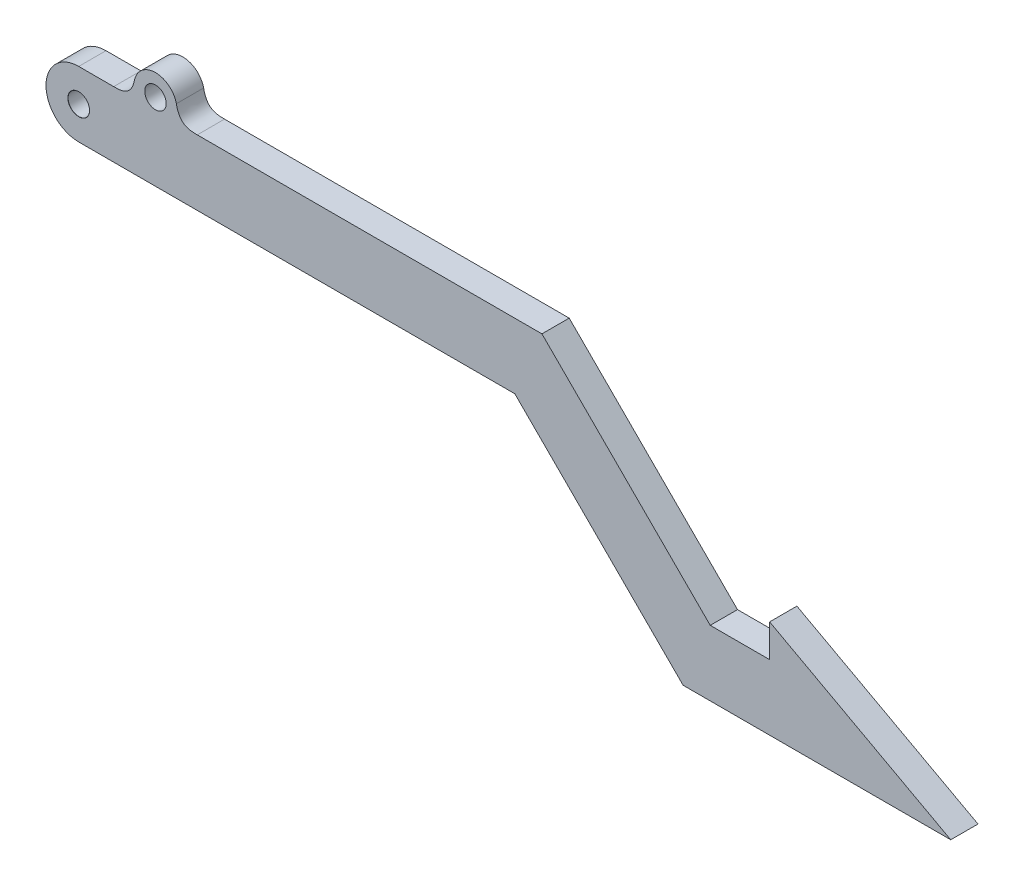
ISO-10303-21;
HEADER;
FILE_DESCRIPTION(('STEP AP214'),'2;1');
FILE_NAME('part.step','',(''),(''),'','','');
FILE_SCHEMA(('AUTOMOTIVE_DESIGN { 1 0 10303 214 1 1 1 1 }'));
ENDSEC;
DATA;
#1=APPLICATION_CONTEXT('core data for automotive mechanical design processes');
#2=APPLICATION_PROTOCOL_DEFINITION('international standard','automotive_design',2000,#1);
#3=PRODUCT_CONTEXT('',#1,'mechanical');
#4=PRODUCT('Part','Part','',(#3));
#5=PRODUCT_RELATED_PRODUCT_CATEGORY('part','',(#4));
#6=PRODUCT_DEFINITION_FORMATION('','',#4);
#7=PRODUCT_DEFINITION_CONTEXT('part definition',#1,'design');
#8=PRODUCT_DEFINITION('design','',#6,#7);
#9=PRODUCT_DEFINITION_SHAPE('','',#8);
#10=(LENGTH_UNIT() NAMED_UNIT(*) SI_UNIT(.MILLI.,.METRE.));
#11=(NAMED_UNIT(*) PLANE_ANGLE_UNIT() SI_UNIT($,.RADIAN.));
#12=(NAMED_UNIT(*) SI_UNIT($,.STERADIAN.) SOLID_ANGLE_UNIT());
#13=UNCERTAINTY_MEASURE_WITH_UNIT(LENGTH_MEASURE(1.E-05),#10,'distance_accuracy_value','');
#14=(GEOMETRIC_REPRESENTATION_CONTEXT(3) GLOBAL_UNCERTAINTY_ASSIGNED_CONTEXT((#13)) GLOBAL_UNIT_ASSIGNED_CONTEXT((#10,
#11,#12)) REPRESENTATION_CONTEXT('',''));
#15=CARTESIAN_POINT('',(0.,0.,0.));
#16=DIRECTION('',(0.,0.,1.));
#17=DIRECTION('',(1.,0.,0.));
#18=AXIS2_PLACEMENT_3D('',#15,#16,#17);
#19=CARTESIAN_POINT('',(0.,52.1634824299942,6.35));
#20=DIRECTION('',(0.,-1.,0.));
#21=DIRECTION('',(1.,0.,0.));
#22=AXIS2_PLACEMENT_3D('',#19,#20,#21);
#23=PLANE('',#22);
#24=DIRECTION('',(-1.,0.,0.));
#25=VECTOR('',#24,1.);
#26=CARTESIAN_POINT('',(0.,52.1634824299942,0.));
#27=LINE('',#26,#25);
#28=CARTESIAN_POINT('',(49.940977794731,52.1634824299942,0.));
#29=VERTEX_POINT('',#28);
#30=CARTESIAN_POINT('',(-30.3177141220988,52.1634824299942,0.));
#31=VERTEX_POINT('',#30);
#32=EDGE_CURVE('E223',#29,#31,#27,.T.);
#33=ORIENTED_EDGE('',*,*,#32,.T.);
#34=CARTESIAN_POINT('',(-30.3177141220988,52.1634824299942,6.6675));
#35=CARTESIAN_POINT('',(-30.3177141220988,52.1634824299942,4.33916666666641));
#36=CARTESIAN_POINT('',(-30.3177141220988,52.1634824299942,2.01083333333333));
#37=CARTESIAN_POINT('',(-30.3177141220988,52.1634824299942,-0.3175));
#38=B_SPLINE_CURVE_WITH_KNOTS('',3,(#34,#35,#36,#37),.UNSPECIFIED.,.F.,.F.,(4,4),(-0.0066675,
0.0003175),.UNSPECIFIED.);
#39=CARTESIAN_POINT('',(-30.3177141220988,52.1634824299942,6.35));
#40=VERTEX_POINT('',#39);
#41=EDGE_CURVE('E345',#31,#40,#38,.F.);
#42=ORIENTED_EDGE('',*,*,#41,.T.);
#43=DIRECTION('',(-1.,0.,0.));
#44=VECTOR('',#43,1.);
#45=CARTESIAN_POINT('',(0.,52.1634824299942,6.35));
#46=LINE('',#45,#44);
#47=CARTESIAN_POINT('',(49.940977794731,52.1634824299942,6.35));
#48=VERTEX_POINT('',#47);
#49=EDGE_CURVE('E158',#48,#40,#46,.T.);
#50=ORIENTED_EDGE('',*,*,#49,.F.);
#51=DIRECTION('',(0.,0.,-1.));
#52=VECTOR('',#51,1.);
#53=CARTESIAN_POINT('',(49.940977794731,52.1634824299942,6.35));
#54=LINE('',#53,#52);
#55=EDGE_CURVE('E436',#48,#29,#54,.T.);
#56=ORIENTED_EDGE('',*,*,#55,.T.);
#57=EDGE_LOOP('',(#33,#42,#50,#56));
#58=FACE_BOUND('',#57,.T.);
#59=ADVANCED_FACE('F49',(#58),#23,.F.);
#60=CARTESIAN_POINT('',(-49.7809356886843,52.1634824299942,6.35));
#61=VERTEX_POINT('',#60);
#62=CARTESIAN_POINT('',(-57.9219241759929,52.1634824299942,6.35));
#63=VERTEX_POINT('',#62);
#64=EDGE_CURVE('E149',#61,#63,#46,.T.);
#65=ORIENTED_EDGE('',*,*,#64,.F.);
#66=CARTESIAN_POINT('',(-49.7809356886843,52.1634824299942,-0.3175));
#67=CARTESIAN_POINT('',(-49.7809356886843,52.1634824299942,2.01083333333333));
#68=CARTESIAN_POINT('',(-49.7809356886843,52.1634824299942,4.33916666666641));
#69=CARTESIAN_POINT('',(-49.7809356886843,52.1634824299942,6.6675));
#70=B_SPLINE_CURVE_WITH_KNOTS('',3,(#66,#67,#68,#69),.UNSPECIFIED.,.F.,.F.,(4,4),(-0.0066675,
0.0003175),.UNSPECIFIED.);
#71=CARTESIAN_POINT('',(-49.7809356886843,52.1634824299942,0.));
#72=VERTEX_POINT('',#71);
#73=EDGE_CURVE('E363',#61,#72,#70,.F.);
#74=ORIENTED_EDGE('',*,*,#73,.T.);
#75=CARTESIAN_POINT('',(-57.9219241759929,52.1634824299942,0.));
#76=VERTEX_POINT('',#75);
#77=EDGE_CURVE('E173',#72,#76,#27,.T.);
#78=ORIENTED_EDGE('',*,*,#77,.T.);
#79=DIRECTION('',(0.,0.,-1.));
#80=VECTOR('',#79,1.);
#81=CARTESIAN_POINT('',(-57.9219241759929,52.1634824299942,6.35));
#82=LINE('',#81,#80);
#83=EDGE_CURVE('E164',#63,#76,#82,.T.);
#84=ORIENTED_EDGE('',*,*,#83,.F.);
#85=EDGE_LOOP('',(#65,#74,#78,#84));
#86=FACE_BOUND('',#85,.T.);
#87=ADVANCED_FACE('F171',(#86),#23,.F.);
#88=CARTESIAN_POINT('',(-57.9219241759929,44.5434824299942,6.35));
#89=DIRECTION('',(0.,0.,-1.));
#90=DIRECTION('',(-1.,0.,0.));
#91=AXIS2_PLACEMENT_3D('',#88,#89,#90);
#92=CYLINDRICAL_SURFACE('',#91,7.61999999999999);
#93=CARTESIAN_POINT('',(-57.9219241759929,44.5434824299942,0.));
#94=DIRECTION('',(0.,0.,1.));
#95=DIRECTION('',(1.,0.,0.));
#96=AXIS2_PLACEMENT_3D('',#93,#94,#95);
#97=CIRCLE('',#96,7.61999999999999);
#98=CARTESIAN_POINT('',(-57.9219241759929,36.9234824299942,0.));
#99=VERTEX_POINT('',#98);
#100=EDGE_CURVE('E228',#76,#99,#97,.T.);
#101=ORIENTED_EDGE('',*,*,#100,.T.);
#102=DIRECTION('',(0.,0.,-1.));
#103=VECTOR('',#102,1.);
#104=CARTESIAN_POINT('',(-57.9219241759929,36.9234824299942,6.35));
#105=LINE('',#104,#103);
#106=CARTESIAN_POINT('',(-57.9219241759929,36.9234824299942,6.35));
#107=VERTEX_POINT('',#106);
#108=EDGE_CURVE('E166',#107,#99,#105,.T.);
#109=ORIENTED_EDGE('',*,*,#108,.F.);
#110=CARTESIAN_POINT('',(-57.9219241759929,44.5434824299942,6.35));
#111=DIRECTION('',(0.,0.,1.));
#112=DIRECTION('',(1.,0.,0.));
#113=AXIS2_PLACEMENT_3D('',#110,#111,#112);
#114=CIRCLE('',#113,7.61999999999999);
#115=EDGE_CURVE('E153',#63,#107,#114,.T.);
#116=ORIENTED_EDGE('',*,*,#115,.F.);
#117=ORIENTED_EDGE('',*,*,#83,.T.);
#118=EDGE_LOOP('',(#101,#109,#116,#117));
#119=FACE_BOUND('',#118,.T.);
#120=ADVANCED_FACE('F163',(#119),#92,.T.);
#121=CARTESIAN_POINT('',(0.,36.9234824299942,6.35));
#122=DIRECTION('',(0.,1.,0.));
#123=DIRECTION('',(0.,0.,1.));
#124=AXIS2_PLACEMENT_3D('',#121,#122,#123);
#125=PLANE('',#124);
#126=DIRECTION('',(1.,0.,0.));
#127=VECTOR('',#126,1.);
#128=CARTESIAN_POINT('',(0.,36.9234824299942,0.));
#129=LINE('',#128,#127);
#130=CARTESIAN_POINT('',(43.628363104165,36.9234824299942,0.));
#131=VERTEX_POINT('',#130);
#132=EDGE_CURVE('E474',#99,#131,#129,.T.);
#133=ORIENTED_EDGE('',*,*,#132,.T.);
#134=DIRECTION('',(0.,0.,-1.));
#135=VECTOR('',#134,1.);
#136=CARTESIAN_POINT('',(43.628363104165,36.9234824299942,6.35));
#137=LINE('',#136,#135);
#138=CARTESIAN_POINT('',(43.628363104165,36.9234824299942,6.35));
#139=VERTEX_POINT('',#138);
#140=EDGE_CURVE('E181',#139,#131,#137,.T.);
#141=ORIENTED_EDGE('',*,*,#140,.F.);
#142=DIRECTION('',(1.,0.,0.));
#143=VECTOR('',#142,1.);
#144=CARTESIAN_POINT('',(0.,36.9234824299942,6.35));
#145=LINE('',#144,#143);
#146=EDGE_CURVE('E169',#107,#139,#145,.T.);
#147=ORIENTED_EDGE('',*,*,#146,.F.);
#148=ORIENTED_EDGE('',*,*,#108,.T.);
#149=EDGE_LOOP('',(#133,#141,#147,#148));
#150=FACE_BOUND('',#149,.T.);
#151=ADVANCED_FACE('F520',(#150),#125,.F.);
#152=CARTESIAN_POINT('',(40.2759227670796,40.2759227670796,6.35));
#153=DIRECTION('',(0.707106781186547,0.707106781186548,0.));
#154=DIRECTION('',(-0.707106781186548,0.707106781186547,0.));
#155=AXIS2_PLACEMENT_3D('',#152,#153,#154);
#156=PLANE('',#155);
#157=DIRECTION('',(0.707106781186548,-0.707106781186547,0.));
#158=VECTOR('',#157,1.);
#159=CARTESIAN_POINT('',(40.2759227670796,40.2759227670796,0.));
#160=LINE('',#159,#158);
#161=CARTESIAN_POINT('',(82.8167567596566,-2.26491122549737,0.));
#162=VERTEX_POINT('',#161);
#163=EDGE_CURVE('E469',#131,#162,#160,.T.);
#164=ORIENTED_EDGE('',*,*,#163,.T.);
#165=DIRECTION('',(0.,0.,-1.));
#166=VECTOR('',#165,1.);
#167=CARTESIAN_POINT('',(82.8167567596566,-2.26491122549737,6.35));
#168=LINE('',#167,#166);
#169=CARTESIAN_POINT('',(82.8167567596566,-2.26491122549737,6.35));
#170=VERTEX_POINT('',#169);
#171=EDGE_CURVE('E458',#170,#162,#168,.T.);
#172=ORIENTED_EDGE('',*,*,#171,.F.);
#173=DIRECTION('',(0.707106781186548,-0.707106781186547,0.));
#174=VECTOR('',#173,1.);
#175=CARTESIAN_POINT('',(40.2759227670796,40.2759227670796,6.35));
#176=LINE('',#175,#174);
#177=EDGE_CURVE('E470',#139,#170,#176,.T.);
#178=ORIENTED_EDGE('',*,*,#177,.F.);
#179=ORIENTED_EDGE('',*,*,#140,.T.);
#180=EDGE_LOOP('',(#164,#172,#178,#179));
#181=FACE_BOUND('',#180,.T.);
#182=ADVANCED_FACE('F467',(#181),#156,.F.);
#183=CARTESIAN_POINT('',(0.,-2.26491122549738,6.35));
#184=DIRECTION('',(0.,1.,0.));
#185=DIRECTION('',(0.,0.,1.));
#186=AXIS2_PLACEMENT_3D('',#183,#184,#185);
#187=PLANE('',#186);
#188=DIRECTION('',(1.,0.,0.));
#189=VECTOR('',#188,1.);
#190=CARTESIAN_POINT('',(0.,-2.26491122549738,0.));
#191=LINE('',#190,#189);
#192=CARTESIAN_POINT('',(145.132424057657,-2.26491122549738,0.));
#193=VERTEX_POINT('',#192);
#194=EDGE_CURVE('E476',#162,#193,#191,.T.);
#195=ORIENTED_EDGE('',*,*,#194,.T.);
#196=DIRECTION('',(0.,0.,-1.));
#197=VECTOR('',#196,1.);
#198=CARTESIAN_POINT('',(145.132424057657,-2.26491122549738,6.35));
#199=LINE('',#198,#197);
#200=CARTESIAN_POINT('',(145.132424057657,-2.26491122549738,6.35));
#201=VERTEX_POINT('',#200);
#202=EDGE_CURVE('E454',#201,#193,#199,.T.);
#203=ORIENTED_EDGE('',*,*,#202,.F.);
#204=DIRECTION('',(1.,0.,0.));
#205=VECTOR('',#204,1.);
#206=CARTESIAN_POINT('',(0.,-2.26491122549738,6.35));
#207=LINE('',#206,#205);
#208=EDGE_CURVE('E496',#170,#201,#207,.T.);
#209=ORIENTED_EDGE('',*,*,#208,.F.);
#210=ORIENTED_EDGE('',*,*,#171,.T.);
#211=EDGE_LOOP('',(#195,#203,#209,#210));
#212=FACE_BOUND('',#211,.T.);
#213=ADVANCED_FACE('F519',(#212),#187,.F.);
#214=CARTESIAN_POINT('',(32.0142461665295,59.0562114985163,6.35));
#215=DIRECTION('',(-0.476576210000259,-0.879133161734779,0.));
#216=DIRECTION('',(0.879133161734779,-0.476576210000259,0.));
#217=AXIS2_PLACEMENT_3D('',#214,#215,#216);
#218=PLANE('',#217);
#219=DIRECTION('',(-0.879133161734779,0.476576210000259,0.));
#220=VECTOR('',#219,1.);
#221=CARTESIAN_POINT('',(32.0142461665295,59.0562114985163,0.));
#222=LINE('',#221,#220);
#223=CARTESIAN_POINT('',(102.962916525491,20.5950887745026,0.));
#224=VERTEX_POINT('',#223);
#225=EDGE_CURVE('E481',#193,#224,#222,.T.);
#226=ORIENTED_EDGE('',*,*,#225,.T.);
#227=DIRECTION('',(0.,0.,-1.));
#228=VECTOR('',#227,1.);
#229=CARTESIAN_POINT('',(102.962916525491,20.5950887745026,6.35));
#230=LINE('',#229,#228);
#231=CARTESIAN_POINT('',(102.962916525491,20.5950887745026,6.35));
#232=VERTEX_POINT('',#231);
#233=EDGE_CURVE('E450',#232,#224,#230,.T.);
#234=ORIENTED_EDGE('',*,*,#233,.F.);
#235=DIRECTION('',(-0.879133161734779,0.476576210000259,0.));
#236=VECTOR('',#235,1.);
#237=CARTESIAN_POINT('',(32.0142461665295,59.0562114985163,6.35));
#238=LINE('',#237,#236);
#239=EDGE_CURVE('E499',#201,#232,#238,.T.);
#240=ORIENTED_EDGE('',*,*,#239,.F.);
#241=ORIENTED_EDGE('',*,*,#202,.T.);
#242=EDGE_LOOP('',(#226,#234,#240,#241));
#243=FACE_BOUND('',#242,.T.);
#244=ADVANCED_FACE('F515',(#243),#218,.F.);
#245=CARTESIAN_POINT('',(102.962916525491,0.,6.35));
#246=DIRECTION('',(1.,0.,0.));
#247=DIRECTION('',(0.,0.,-1.));
#248=AXIS2_PLACEMENT_3D('',#245,#246,#247);
#249=PLANE('',#248);
#250=DIRECTION('',(0.,-1.,0.));
#251=VECTOR('',#250,1.);
#252=CARTESIAN_POINT('',(102.962916525491,0.,0.));
#253=LINE('',#252,#251);
#254=CARTESIAN_POINT('',(102.962916525491,12.9750887745026,0.));
#255=VERTEX_POINT('',#254);
#256=EDGE_CURVE('E486',#224,#255,#253,.T.);
#257=ORIENTED_EDGE('',*,*,#256,.T.);
#258=DIRECTION('',(0.,0.,-1.));
#259=VECTOR('',#258,1.);
#260=CARTESIAN_POINT('',(102.962916525491,12.9750887745026,6.35));
#261=LINE('',#260,#259);
#262=CARTESIAN_POINT('',(102.962916525491,12.9750887745026,6.35));
#263=VERTEX_POINT('',#262);
#264=EDGE_CURVE('E442',#263,#255,#261,.T.);
#265=ORIENTED_EDGE('',*,*,#264,.F.);
#266=DIRECTION('',(0.,-1.,0.));
#267=VECTOR('',#266,1.);
#268=CARTESIAN_POINT('',(102.962916525491,0.,6.35));
#269=LINE('',#268,#267);
#270=EDGE_CURVE('E502',#232,#263,#269,.T.);
#271=ORIENTED_EDGE('',*,*,#270,.F.);
#272=ORIENTED_EDGE('',*,*,#233,.T.);
#273=EDGE_LOOP('',(#257,#265,#271,#272));
#274=FACE_BOUND('',#273,.T.);
#275=ADVANCED_FACE('F511',(#274),#249,.F.);
#276=CARTESIAN_POINT('',(0.,12.9750887745026,6.35));
#277=DIRECTION('',(0.,-1.,0.));
#278=DIRECTION('',(0.,0.,-1.));
#279=AXIS2_PLACEMENT_3D('',#276,#277,#278);
#280=PLANE('',#279);
#281=DIRECTION('',(-1.,0.,0.));
#282=VECTOR('',#281,1.);
#283=CARTESIAN_POINT('',(0.,12.9750887745026,0.));
#284=LINE('',#283,#282);
#285=CARTESIAN_POINT('',(89.1293714502226,12.9750887745026,0.));
#286=VERTEX_POINT('',#285);
#287=EDGE_CURVE('E488',#255,#286,#284,.T.);
#288=ORIENTED_EDGE('',*,*,#287,.T.);
#289=DIRECTION('',(0.,0.,-1.));
#290=VECTOR('',#289,1.);
#291=CARTESIAN_POINT('',(89.1293714502226,12.9750887745026,6.35));
#292=LINE('',#291,#290);
#293=CARTESIAN_POINT('',(89.1293714502226,12.9750887745026,6.35));
#294=VERTEX_POINT('',#293);
#295=EDGE_CURVE('E439',#294,#286,#292,.T.);
#296=ORIENTED_EDGE('',*,*,#295,.F.);
#297=DIRECTION('',(-1.,0.,0.));
#298=VECTOR('',#297,1.);
#299=CARTESIAN_POINT('',(0.,12.9750887745026,6.35));
#300=LINE('',#299,#298);
#301=EDGE_CURVE('E431',#263,#294,#300,.T.);
#302=ORIENTED_EDGE('',*,*,#301,.F.);
#303=ORIENTED_EDGE('',*,*,#264,.T.);
#304=EDGE_LOOP('',(#288,#296,#302,#303));
#305=FACE_BOUND('',#304,.T.);
#306=ADVANCED_FACE('F513',(#305),#280,.F.);
#307=CARTESIAN_POINT('',(51.0522301123626,51.0522301123626,6.35));
#308=DIRECTION('',(-0.707106781186547,-0.707106781186548,0.));
#309=DIRECTION('',(0.707106781186548,-0.707106781186547,0.));
#310=AXIS2_PLACEMENT_3D('',#307,#308,#309);
#311=PLANE('',#310);
#312=DIRECTION('',(-0.707106781186548,0.707106781186547,0.));
#313=VECTOR('',#312,1.);
#314=CARTESIAN_POINT('',(51.0522301123626,51.0522301123626,0.));
#315=LINE('',#314,#313);
#316=EDGE_CURVE('E159',#286,#29,#315,.T.);
#317=ORIENTED_EDGE('',*,*,#316,.T.);
#318=ORIENTED_EDGE('',*,*,#55,.F.);
#319=DIRECTION('',(-0.707106781186548,0.707106781186547,0.));
#320=VECTOR('',#319,1.);
#321=CARTESIAN_POINT('',(51.0522301123626,51.0522301123626,6.35));
#322=LINE('',#321,#320);
#323=EDGE_CURVE('E233',#294,#48,#322,.T.);
#324=ORIENTED_EDGE('',*,*,#323,.F.);
#325=ORIENTED_EDGE('',*,*,#295,.T.);
#326=EDGE_LOOP('',(#317,#318,#324,#325));
#327=FACE_BOUND('',#326,.T.);
#328=ADVANCED_FACE('F290',(#327),#311,.F.);
#329=CARTESIAN_POINT('',(0.,0.,6.35));
#330=DIRECTION('',(0.,0.,1.));
#331=DIRECTION('',(1.,0.,0.));
#332=AXIS2_PLACEMENT_3D('',#329,#330,#331);
#333=PLANE('',#332);
#334=CARTESIAN_POINT('',(-40.0493249053916,54.8622324299942,6.35));
#335=DIRECTION('',(0.,0.,1.));
#336=DIRECTION('',(1.,0.,0.));
#337=AXIS2_PLACEMENT_3D('',#334,#335,#336);
#338=CIRCLE('',#337,2.49999999999999);
#339=CARTESIAN_POINT('',(-37.5493249053916,54.8622324299942,6.35));
#340=VERTEX_POINT('',#339);
#341=EDGE_CURVE('E388',#340,#340,#338,.T.);
#342=ORIENTED_EDGE('',*,*,#341,.F.);
#343=EDGE_LOOP('',(#342));
#344=FACE_BOUND('',#343,.T.);
#345=CARTESIAN_POINT('',(-57.9219241759929,44.5434824299942,6.35));
#346=DIRECTION('',(0.,0.,1.));
#347=DIRECTION('',(1.,0.,0.));
#348=AXIS2_PLACEMENT_3D('',#345,#346,#347);
#349=CIRCLE('',#348,2.525);
#350=CARTESIAN_POINT('',(-55.3969241759929,44.5434824299942,6.35));
#351=VERTEX_POINT('',#350);
#352=EDGE_CURVE('E198',#351,#351,#349,.T.);
#353=ORIENTED_EDGE('',*,*,#352,.F.);
#354=EDGE_LOOP('',(#353));
#355=FACE_BOUND('',#354,.T.);
#356=ORIENTED_EDGE('',*,*,#49,.T.);
#357=CARTESIAN_POINT('',(-35.1835195137452,56.0128574299942,6.35));
#358=CARTESIAN_POINT('',(-35.077384253147,55.564028729712,6.35));
#359=CARTESIAN_POINT('',(-34.9863108074129,54.9478109932965,6.35));
#360=CARTESIAN_POINT('',(-34.337985858082,53.1686640703043,6.35));
#361=CARTESIAN_POINT('',(-33.1240301911534,52.3875992225822,6.35));
#362=CARTESIAN_POINT('',(-31.6934282258718,52.1634824299942,6.35));
#363=CARTESIAN_POINT('',(-31.0055711739853,52.1634824299942,6.35));
#364=CARTESIAN_POINT('',(-30.3177141220988,52.1634824299942,6.35));
#365=B_SPLINE_CURVE_WITH_KNOTS('',5,(#357,#358,#359,#360,#361,#362,#363,#364),.UNSPECIFIED.,.F.,
.F.,(6,2,6),(0.,0.5,1.),.UNSPECIFIED.);
#366=CARTESIAN_POINT('',(-35.1835195137452,56.0128574299942,6.35));
#367=VERTEX_POINT('',#366);
#368=EDGE_CURVE('E335',#40,#367,#365,.F.);
#369=ORIENTED_EDGE('',*,*,#368,.T.);
#370=CARTESIAN_POINT('',(-40.0493249053916,54.8622324299942,6.35));
#371=DIRECTION('',(0.,0.,1.));
#372=DIRECTION('',(1.,0.,0.));
#373=AXIS2_PLACEMENT_3D('',#370,#371,#372);
#374=CIRCLE('',#373,5.);
#375=CARTESIAN_POINT('',(-44.915130297038,56.0128574299942,6.35));
#376=VERTEX_POINT('',#375);
#377=EDGE_CURVE('E190',#367,#376,#374,.T.);
#378=ORIENTED_EDGE('',*,*,#377,.T.);
#379=CARTESIAN_POINT('',(-49.7809356886843,52.1634824299942,6.35));
#380=CARTESIAN_POINT('',(-49.0930786367979,52.1634824299942,6.35));
#381=CARTESIAN_POINT('',(-48.4052215849114,52.1634824299942,6.35));
#382=CARTESIAN_POINT('',(-46.9746196196298,52.3875992225822,6.35));
#383=CARTESIAN_POINT('',(-45.7606639527012,53.1686640703043,6.35));
#384=CARTESIAN_POINT('',(-45.1123390033702,54.9478109932965,6.35));
#385=CARTESIAN_POINT('',(-45.0212655576361,55.564028729712,6.35));
#386=CARTESIAN_POINT('',(-44.915130297038,56.0128574299942,6.35));
#387=B_SPLINE_CURVE_WITH_KNOTS('',5,(#379,#380,#381,#382,#383,#384,#385,#386),.UNSPECIFIED.,.F.,
.F.,(6,2,6),(0.,0.5,1.),.UNSPECIFIED.);
#388=EDGE_CURVE('E11',#376,#61,#387,.F.);
#389=ORIENTED_EDGE('',*,*,#388,.T.);
#390=ORIENTED_EDGE('',*,*,#64,.T.);
#391=ORIENTED_EDGE('',*,*,#115,.T.);
#392=ORIENTED_EDGE('',*,*,#146,.T.);
#393=ORIENTED_EDGE('',*,*,#177,.T.);
#394=ORIENTED_EDGE('',*,*,#208,.T.);
#395=ORIENTED_EDGE('',*,*,#239,.T.);
#396=ORIENTED_EDGE('',*,*,#270,.T.);
#397=ORIENTED_EDGE('',*,*,#301,.T.);
#398=ORIENTED_EDGE('',*,*,#323,.T.);
#399=EDGE_LOOP('',(#356,#369,#378,#389,#390,#391,#392,#393,#394,#395,#396,#397,#398));
#400=FACE_BOUND('',#399,.T.);
#401=ADVANCED_FACE('F152',(#344,#355,#400),#333,.T.);
#402=CARTESIAN_POINT('',(0.,0.,0.));
#403=DIRECTION('',(0.,0.,1.));
#404=DIRECTION('',(1.,0.,0.));
#405=AXIS2_PLACEMENT_3D('',#402,#403,#404);
#406=PLANE('',#405);
#407=CARTESIAN_POINT('',(-40.0493249053916,54.8622324299942,0.));
#408=DIRECTION('',(0.,0.,1.));
#409=DIRECTION('',(1.,0.,0.));
#410=AXIS2_PLACEMENT_3D('',#407,#408,#409);
#411=CIRCLE('',#410,2.49999999999999);
#412=CARTESIAN_POINT('',(-37.5493249053916,54.8622324299942,0.));
#413=VERTEX_POINT('',#412);
#414=EDGE_CURVE('E191',#413,#413,#411,.T.);
#415=ORIENTED_EDGE('',*,*,#414,.T.);
#416=EDGE_LOOP('',(#415));
#417=FACE_BOUND('',#416,.T.);
#418=CARTESIAN_POINT('',(-57.9219241759929,44.5434824299942,0.));
#419=DIRECTION('',(0.,0.,1.));
#420=DIRECTION('',(1.,0.,0.));
#421=AXIS2_PLACEMENT_3D('',#418,#419,#420);
#422=CIRCLE('',#421,2.5);
#423=CARTESIAN_POINT('',(-55.4219241759929,44.5434824299942,0.));
#424=VERTEX_POINT('',#423);
#425=EDGE_CURVE('E206',#424,#424,#422,.T.);
#426=ORIENTED_EDGE('',*,*,#425,.T.);
#427=EDGE_LOOP('',(#426));
#428=FACE_BOUND('',#427,.T.);
#429=ORIENTED_EDGE('',*,*,#32,.F.);
#430=ORIENTED_EDGE('',*,*,#316,.F.);
#431=ORIENTED_EDGE('',*,*,#287,.F.);
#432=ORIENTED_EDGE('',*,*,#256,.F.);
#433=ORIENTED_EDGE('',*,*,#225,.F.);
#434=ORIENTED_EDGE('',*,*,#194,.F.);
#435=ORIENTED_EDGE('',*,*,#163,.F.);
#436=ORIENTED_EDGE('',*,*,#132,.F.);
#437=ORIENTED_EDGE('',*,*,#100,.F.);
#438=ORIENTED_EDGE('',*,*,#77,.F.);
#439=CARTESIAN_POINT('',(-44.915130297038,56.0128574299942,0.));
#440=CARTESIAN_POINT('',(-45.0212655576361,55.564028729712,0.));
#441=CARTESIAN_POINT('',(-45.1123390033702,54.9478109932965,0.));
#442=CARTESIAN_POINT('',(-45.7606639527012,53.1686640703043,0.));
#443=CARTESIAN_POINT('',(-46.9746196196298,52.3875992225822,0.));
#444=CARTESIAN_POINT('',(-48.4052215849114,52.1634824299942,0.));
#445=CARTESIAN_POINT('',(-49.0930786367979,52.1634824299942,0.));
#446=CARTESIAN_POINT('',(-49.7809356886844,52.1634824299942,0.));
#447=B_SPLINE_CURVE_WITH_KNOTS('',5,(#439,#440,#441,#442,#443,#444,#445,#446),.UNSPECIFIED.,.F.,
.F.,(6,2,6),(0.,0.5,1.),.UNSPECIFIED.);
#448=CARTESIAN_POINT('',(-44.915130297038,56.0128574299942,0.));
#449=VERTEX_POINT('',#448);
#450=EDGE_CURVE('E64',#72,#449,#447,.F.);
#451=ORIENTED_EDGE('',*,*,#450,.T.);
#452=CARTESIAN_POINT('',(-40.0493249053916,54.8622324299942,0.));
#453=DIRECTION('',(0.,0.,1.));
#454=DIRECTION('',(1.,0.,0.));
#455=AXIS2_PLACEMENT_3D('',#452,#453,#454);
#456=CIRCLE('',#455,5.);
#457=CARTESIAN_POINT('',(-35.1835195137452,56.0128574299942,0.));
#458=VERTEX_POINT('',#457);
#459=EDGE_CURVE('E185',#458,#449,#456,.T.);
#460=ORIENTED_EDGE('',*,*,#459,.F.);
#461=CARTESIAN_POINT('',(-30.3177141220988,52.1634824299942,0.));
#462=CARTESIAN_POINT('',(-31.0055711739853,52.1634824299942,0.));
#463=CARTESIAN_POINT('',(-31.6934282258718,52.1634824299942,0.));
#464=CARTESIAN_POINT('',(-33.1240301911534,52.3875992225822,0.));
#465=CARTESIAN_POINT('',(-34.337985858082,53.1686640703043,0.));
#466=CARTESIAN_POINT('',(-34.9863108074129,54.9478109932965,0.));
#467=CARTESIAN_POINT('',(-35.077384253147,55.564028729712,0.));
#468=CARTESIAN_POINT('',(-35.1835195137452,56.0128574299942,0.));
#469=B_SPLINE_CURVE_WITH_KNOTS('',5,(#461,#462,#463,#464,#465,#466,#467,#468),.UNSPECIFIED.,.F.,
.F.,(6,2,6),(0.,0.5,1.),.UNSPECIFIED.);
#470=EDGE_CURVE('E270',#458,#31,#469,.F.);
#471=ORIENTED_EDGE('',*,*,#470,.T.);
#472=EDGE_LOOP('',(#429,#430,#431,#432,#433,#434,#435,#436,#437,#438,#451,#460,#471));
#473=FACE_BOUND('',#472,.T.);
#474=ADVANCED_FACE('F276',(#417,#428,#473),#406,.F.);
#475=CARTESIAN_POINT('',(-57.9219241759929,44.5434824299942,6.35));
#476=DIRECTION('',(0.,0.,1.));
#477=DIRECTION('',(1.,0.,0.));
#478=AXIS2_PLACEMENT_3D('',#475,#476,#477);
#479=CYLINDRICAL_SURFACE('',#478,2.5);
#480=ORIENTED_EDGE('',*,*,#425,.F.);
#481=EDGE_LOOP('',(#480));
#482=FACE_BOUND('',#481,.T.);
#483=CARTESIAN_POINT('',(-57.9219241759929,44.5434824299942,6.325));
#484=DIRECTION('',(0.,0.,1.));
#485=DIRECTION('',(1.,0.,0.));
#486=AXIS2_PLACEMENT_3D('',#483,#484,#485);
#487=CIRCLE('',#486,2.5);
#488=CARTESIAN_POINT('',(-55.4219241759929,44.5434824299942,6.325));
#489=VERTEX_POINT('',#488);
#490=EDGE_CURVE('E202',#489,#489,#487,.T.);
#491=ORIENTED_EDGE('',*,*,#490,.T.);
#492=EDGE_LOOP('',(#491));
#493=FACE_BOUND('',#492,.T.);
#494=ADVANCED_FACE('F286',(#482,#493),#479,.F.);
#495=CARTESIAN_POINT('',(-57.9219241759929,44.5434824299942,6.35));
#496=DIRECTION('',(0.,0.,1.));
#497=DIRECTION('',(1.,0.,0.));
#498=AXIS2_PLACEMENT_3D('',#495,#496,#497);
#499=CONICAL_SURFACE('',#498,2.525,0.785398163397344);
#500=ORIENTED_EDGE('',*,*,#490,.F.);
#501=EDGE_LOOP('',(#500));
#502=FACE_BOUND('',#501,.T.);
#503=ORIENTED_EDGE('',*,*,#352,.T.);
#504=EDGE_LOOP('',(#503));
#505=FACE_BOUND('',#504,.T.);
#506=ADVANCED_FACE('F400',(#502,#505),#499,.F.);
#507=CARTESIAN_POINT('',(-40.0493249053916,54.8622324299942,6.35));
#508=DIRECTION('',(0.,0.,-1.));
#509=DIRECTION('',(-1.,0.,0.));
#510=AXIS2_PLACEMENT_3D('',#507,#508,#509);
#511=CYLINDRICAL_SURFACE('',#510,5.);
#512=ORIENTED_EDGE('',*,*,#377,.F.);
#513=CARTESIAN_POINT('',(-35.1835195137452,56.0128574299942,-0.3175));
#514=CARTESIAN_POINT('',(-35.1835195137452,56.0128574299942,2.01083333333333));
#515=CARTESIAN_POINT('',(-35.1835195137452,56.0128574299942,4.33916666666641));
#516=CARTESIAN_POINT('',(-35.1835195137452,56.0128574299942,6.6675));
#517=B_SPLINE_CURVE_WITH_KNOTS('',3,(#513,#514,#515,#516),.UNSPECIFIED.,.F.,.F.,(4,4),
(-0.0066675,0.0003175),.UNSPECIFIED.);
#518=EDGE_CURVE('E180',#367,#458,#517,.F.);
#519=ORIENTED_EDGE('',*,*,#518,.T.);
#520=ORIENTED_EDGE('',*,*,#459,.T.);
#521=CARTESIAN_POINT('',(-44.915130297038,56.0128574299942,6.6675));
#522=CARTESIAN_POINT('',(-44.915130297038,56.0128574299942,4.33916666666641));
#523=CARTESIAN_POINT('',(-44.915130297038,56.0128574299942,2.01083333333333));
#524=CARTESIAN_POINT('',(-44.915130297038,56.0128574299942,-0.3175));
#525=B_SPLINE_CURVE_WITH_KNOTS('',3,(#521,#522,#523,#524),.UNSPECIFIED.,.F.,.F.,(4,4),
(-0.0066675,0.0003175),.UNSPECIFIED.);
#526=EDGE_CURVE('E176',#449,#376,#525,.F.);
#527=ORIENTED_EDGE('',*,*,#526,.T.);
#528=EDGE_LOOP('',(#512,#519,#520,#527));
#529=FACE_BOUND('',#528,.T.);
#530=ADVANCED_FACE('F382',(#529),#511,.T.);
#531=CARTESIAN_POINT('',(-30.3177141220988,52.1634824299942,-0.3175));
#532=CARTESIAN_POINT('',(-30.3177141220988,52.1634824299942,2.01083333333333));
#533=CARTESIAN_POINT('',(-30.3177141220988,52.1634824299942,4.33916666666641));
#534=CARTESIAN_POINT('',(-30.3177141220988,52.1634824299942,6.6675));
#535=CARTESIAN_POINT('',(-31.0055711739853,52.1634824299942,-0.3175));
#536=CARTESIAN_POINT('',(-31.0055711739853,52.1634824299942,2.01083333333333));
#537=CARTESIAN_POINT('',(-31.0055711739853,52.1634824299942,4.33916666666641));
#538=CARTESIAN_POINT('',(-31.0055711739853,52.1634824299942,6.6675));
#539=CARTESIAN_POINT('',(-31.6934282258718,52.1634824299942,-0.3175));
#540=CARTESIAN_POINT('',(-31.6934282258718,52.1634824299942,2.01083333333333));
#541=CARTESIAN_POINT('',(-31.6934282258718,52.1634824299942,4.33916666666641));
#542=CARTESIAN_POINT('',(-31.6934282258718,52.1634824299942,6.6675));
#543=CARTESIAN_POINT('',(-33.1240301911534,52.3875992225822,-0.3175));
#544=CARTESIAN_POINT('',(-33.1240301911534,52.3875992225822,2.01083333333333));
#545=CARTESIAN_POINT('',(-33.1240301911534,52.3875992225822,4.33916666666641));
#546=CARTESIAN_POINT('',(-33.1240301911534,52.3875992225822,6.6675));
#547=CARTESIAN_POINT('',(-34.337985858082,53.1686640703043,-0.3175));
#548=CARTESIAN_POINT('',(-34.337985858082,53.1686640703043,2.01083333333333));
#549=CARTESIAN_POINT('',(-34.337985858082,53.1686640703043,4.33916666666641));
#550=CARTESIAN_POINT('',(-34.337985858082,53.1686640703043,6.6675));
#551=CARTESIAN_POINT('',(-34.9863108074129,54.9478109932965,-0.3175));
#552=CARTESIAN_POINT('',(-34.9863108074129,54.9478109932965,2.01083333333333));
#553=CARTESIAN_POINT('',(-34.9863108074129,54.9478109932965,4.33916666666641));
#554=CARTESIAN_POINT('',(-34.9863108074129,54.9478109932965,6.6675));
#555=CARTESIAN_POINT('',(-35.077384253147,55.564028729712,-0.3175));
#556=CARTESIAN_POINT('',(-35.077384253147,55.564028729712,2.01083333333333));
#557=CARTESIAN_POINT('',(-35.077384253147,55.564028729712,4.33916666666641));
#558=CARTESIAN_POINT('',(-35.077384253147,55.564028729712,6.6675));
#559=CARTESIAN_POINT('',(-35.1835195137452,56.0128574299942,-0.3175));
#560=CARTESIAN_POINT('',(-35.1835195137452,56.0128574299942,2.01083333333333));
#561=CARTESIAN_POINT('',(-35.1835195137452,56.0128574299942,4.33916666666641));
#562=CARTESIAN_POINT('',(-35.1835195137452,56.0128574299942,6.6675));
#563=B_SPLINE_SURFACE_WITH_KNOTS('',5,3,((#531,#532,#533,#534),(#535,#536,#537,#538),(#539,#540,
#541,#542),(#543,#544,#545,#546),(#547,#548,#549,#550),(#551,#552,#553,#554),(#555,#556,#557,
#558),(#559,#560,#561,#562)),.UNSPECIFIED.,.F.,.F.,.F.,(6,2,6),(4,4),(0.,0.5,1.),(-0.0066675,
0.0003175),.UNSPECIFIED.);
#564=ORIENTED_EDGE('',*,*,#368,.F.);
#565=ORIENTED_EDGE('',*,*,#41,.F.);
#566=ORIENTED_EDGE('',*,*,#470,.F.);
#567=ORIENTED_EDGE('',*,*,#518,.F.);
#568=EDGE_LOOP('',(#564,#565,#566,#567));
#569=FACE_BOUND('',#568,.T.);
#570=ADVANCED_FACE('F252',(#569),#563,.T.);
#571=CARTESIAN_POINT('',(-44.915130297038,56.0128574299942,-0.3175));
#572=CARTESIAN_POINT('',(-44.915130297038,56.0128574299942,2.01083333333333));
#573=CARTESIAN_POINT('',(-44.915130297038,56.0128574299942,4.33916666666641));
#574=CARTESIAN_POINT('',(-44.915130297038,56.0128574299942,6.6675));
#575=CARTESIAN_POINT('',(-45.0212655576361,55.564028729712,-0.3175));
#576=CARTESIAN_POINT('',(-45.0212655576361,55.564028729712,2.01083333333333));
#577=CARTESIAN_POINT('',(-45.0212655576361,55.564028729712,4.33916666666641));
#578=CARTESIAN_POINT('',(-45.0212655576361,55.564028729712,6.6675));
#579=CARTESIAN_POINT('',(-45.1123390033702,54.9478109932965,-0.3175));
#580=CARTESIAN_POINT('',(-45.1123390033702,54.9478109932965,2.01083333333333));
#581=CARTESIAN_POINT('',(-45.1123390033702,54.9478109932965,4.33916666666641));
#582=CARTESIAN_POINT('',(-45.1123390033702,54.9478109932965,6.6675));
#583=CARTESIAN_POINT('',(-45.7606639527012,53.1686640703043,-0.3175));
#584=CARTESIAN_POINT('',(-45.7606639527012,53.1686640703043,2.01083333333333));
#585=CARTESIAN_POINT('',(-45.7606639527012,53.1686640703043,4.33916666666641));
#586=CARTESIAN_POINT('',(-45.7606639527012,53.1686640703043,6.6675));
#587=CARTESIAN_POINT('',(-46.9746196196298,52.3875992225822,-0.3175));
#588=CARTESIAN_POINT('',(-46.9746196196298,52.3875992225822,2.01083333333333));
#589=CARTESIAN_POINT('',(-46.9746196196298,52.3875992225822,4.33916666666641));
#590=CARTESIAN_POINT('',(-46.9746196196298,52.3875992225822,6.6675));
#591=CARTESIAN_POINT('',(-48.4052215849114,52.1634824299942,-0.3175));
#592=CARTESIAN_POINT('',(-48.4052215849114,52.1634824299942,2.01083333333333));
#593=CARTESIAN_POINT('',(-48.4052215849114,52.1634824299942,4.33916666666641));
#594=CARTESIAN_POINT('',(-48.4052215849114,52.1634824299942,6.6675));
#595=CARTESIAN_POINT('',(-49.0930786367979,52.1634824299942,-0.3175));
#596=CARTESIAN_POINT('',(-49.0930786367979,52.1634824299942,2.01083333333333));
#597=CARTESIAN_POINT('',(-49.0930786367979,52.1634824299942,4.33916666666641));
#598=CARTESIAN_POINT('',(-49.0930786367979,52.1634824299942,6.6675));
#599=CARTESIAN_POINT('',(-49.7809356886843,52.1634824299942,-0.3175));
#600=CARTESIAN_POINT('',(-49.7809356886843,52.1634824299942,2.01083333333333));
#601=CARTESIAN_POINT('',(-49.7809356886843,52.1634824299942,4.33916666666641));
#602=CARTESIAN_POINT('',(-49.7809356886843,52.1634824299942,6.6675));
#603=B_SPLINE_SURFACE_WITH_KNOTS('',5,3,((#571,#572,#573,#574),(#575,#576,#577,#578),(#579,#580,
#581,#582),(#583,#584,#585,#586),(#587,#588,#589,#590),(#591,#592,#593,#594),(#595,#596,#597,
#598),(#599,#600,#601,#602)),.UNSPECIFIED.,.F.,.F.,.F.,(6,2,6),(4,4),(0.,0.5,1.),(-0.0066675,
0.0003175),.UNSPECIFIED.);
#604=ORIENTED_EDGE('',*,*,#388,.F.);
#605=ORIENTED_EDGE('',*,*,#526,.F.);
#606=ORIENTED_EDGE('',*,*,#450,.F.);
#607=ORIENTED_EDGE('',*,*,#73,.F.);
#608=EDGE_LOOP('',(#604,#605,#606,#607));
#609=FACE_BOUND('',#608,.T.);
#610=ADVANCED_FACE('F52',(#609),#603,.T.);
#611=CARTESIAN_POINT('',(-40.0493249053916,54.8622324299942,6.35));
#612=DIRECTION('',(0.,0.,1.));
#613=DIRECTION('',(1.,0.,0.));
#614=AXIS2_PLACEMENT_3D('',#611,#612,#613);
#615=CYLINDRICAL_SURFACE('',#614,2.49999999999999);
#616=ORIENTED_EDGE('',*,*,#341,.T.);
#617=EDGE_LOOP('',(#616));
#618=FACE_BOUND('',#617,.T.);
#619=ORIENTED_EDGE('',*,*,#414,.F.);
#620=EDGE_LOOP('',(#619));
#621=FACE_BOUND('',#620,.T.);
#622=ADVANCED_FACE('F393',(#618,#621),#615,.F.);
#623=CLOSED_SHELL('',(#59,#87,#120,#151,#182,#213,#244,#275,#306,#328,#401,#474,#494,#506,#530,
#570,#610,#622));
#624=MANIFOLD_SOLID_BREP('B2',#623);
#625=ADVANCED_BREP_SHAPE_REPRESENTATION('',(#18,#624),#14);
#626=SHAPE_DEFINITION_REPRESENTATION(#9,#625);
ENDSEC;
END-ISO-10303-21;
